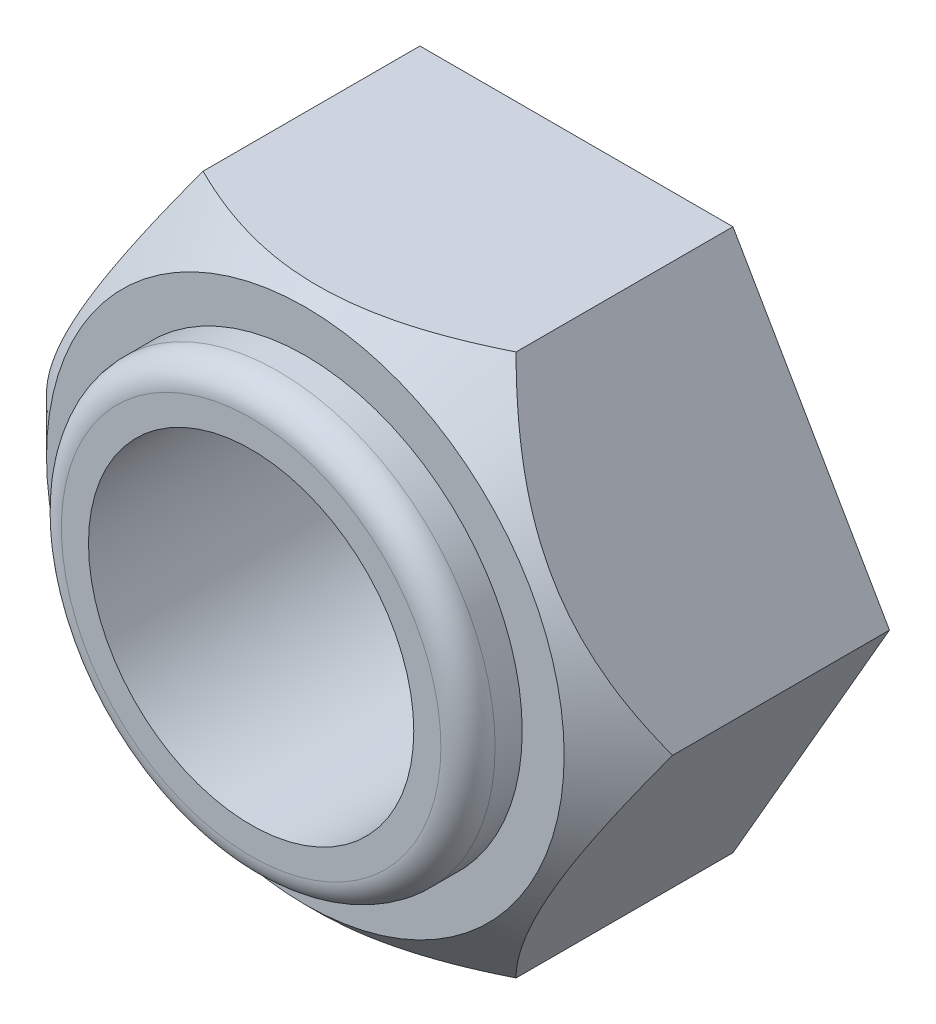
ISO-10303-21;
HEADER;
FILE_DESCRIPTION(('STEP AP214'),'2;1');
FILE_NAME('part.step','',(''),(''),'','','');
FILE_SCHEMA(('AUTOMOTIVE_DESIGN { 1 0 10303 214 1 1 1 1 }'));
ENDSEC;
DATA;
#1=APPLICATION_CONTEXT('core data for automotive mechanical design processes');
#2=APPLICATION_PROTOCOL_DEFINITION('international standard','automotive_design',2000,#1);
#3=PRODUCT_CONTEXT('',#1,'mechanical');
#4=PRODUCT('Part','Part','',(#3));
#5=PRODUCT_RELATED_PRODUCT_CATEGORY('part','',(#4));
#6=PRODUCT_DEFINITION_FORMATION('','',#4);
#7=PRODUCT_DEFINITION_CONTEXT('part definition',#1,'design');
#8=PRODUCT_DEFINITION('design','',#6,#7);
#9=PRODUCT_DEFINITION_SHAPE('','',#8);
#10=(LENGTH_UNIT() NAMED_UNIT(*) SI_UNIT(.MILLI.,.METRE.));
#11=(NAMED_UNIT(*) PLANE_ANGLE_UNIT() SI_UNIT($,.RADIAN.));
#12=(NAMED_UNIT(*) SI_UNIT($,.STERADIAN.) SOLID_ANGLE_UNIT());
#13=UNCERTAINTY_MEASURE_WITH_UNIT(LENGTH_MEASURE(1.E-05),#10,'distance_accuracy_value','');
#14=(GEOMETRIC_REPRESENTATION_CONTEXT(3) GLOBAL_UNCERTAINTY_ASSIGNED_CONTEXT((#13)) GLOBAL_UNIT_ASSIGNED_CONTEXT((#10,
#11,#12)) REPRESENTATION_CONTEXT('',''));
#15=CARTESIAN_POINT('',(0.,0.,0.));
#16=DIRECTION('',(0.,0.,1.));
#17=DIRECTION('',(1.,0.,0.));
#18=AXIS2_PLACEMENT_3D('',#15,#16,#17);
#19=CARTESIAN_POINT('',(2.88675134594812,-5.00000000000002,5.));
#20=DIRECTION('',(-0.866025403784439,0.5,0.));
#21=DIRECTION('',(-0.5,-0.866025403784439,0.));
#22=AXIS2_PLACEMENT_3D('',#19,#20,#21);
#23=PLANE('',#22);
#24=CARTESIAN_POINT('',(2.88663587589429,-5.00020000000002,3.99988452648214));
#25=CARTESIAN_POINT('',(2.93627227674212,-4.91422723182671,4.04951645439575));
#26=CARTESIAN_POINT('',(2.98629020977268,-4.82759363052821,4.09762527471311));
#27=CARTESIAN_POINT('',(3.08716399407134,-4.65287511097118,4.19033336867023));
#28=CARTESIAN_POINT('',(3.13802028490868,-4.56478943135641,4.23493072549852));
#29=CARTESIAN_POINT('',(3.29243146040538,-4.29734143013969,4.36314092787176));
#30=CARTESIAN_POINT('',(3.39729352840467,-4.11571500057819,4.44062493449849));
#31=CARTESIAN_POINT('',(3.60875628789732,-3.74945075722819,4.5733110555745));
#32=CARTESIAN_POINT('',(3.71530292847296,-3.56490656237541,4.62884745935418));
#33=CARTESIAN_POINT('',(3.87687459445692,-3.28505622782764,4.6930895059525));
#34=CARTESIAN_POINT('',(3.9309696979787,-3.19136076008722,4.71131783666138));
#35=CARTESIAN_POINT('',(4.03961794604879,-3.00317647427648,4.7410078128739));
#36=CARTESIAN_POINT('',(4.09417102090353,-2.90868777691896,4.75247046969493));
#37=CARTESIAN_POINT('',(4.22710825098566,-2.67843374019924,4.77168913825404));
#38=CARTESIAN_POINT('',(4.30563563855841,-2.54242031513758,4.77572171174031));
#39=CARTESIAN_POINT('',(4.46254889182113,-2.27063858810562,4.76895414589471));
#40=CARTESIAN_POINT('',(4.5409346982583,-2.13487038876419,4.75814880702902));
#41=CARTESIAN_POINT('',(4.69696731557988,-1.86461396792526,4.72234235010198));
#42=CARTESIAN_POINT('',(4.77461320108935,-1.73012734922417,4.69732535604176));
#43=CARTESIAN_POINT('',(4.92857043343805,-1.46346560060355,4.63445567501059));
#44=CARTESIAN_POINT('',(5.00488188213303,-1.33129029426464,4.59660397223246));
#45=CARTESIAN_POINT('',(5.14035048372463,-1.0966517934777,4.51873011323949));
#46=CARTESIAN_POINT('',(5.19980756415579,-0.993669109301218,4.480755749581));
#47=CARTESIAN_POINT('',(5.31765436322277,-0.789552465807839,4.39868737382608));
#48=CARTESIAN_POINT('',(5.37604404938545,-0.68841856273609,4.35459317589647));
#49=CARTESIAN_POINT('',(5.49157215635531,-0.488318011762032,4.26127361464766));
#50=CARTESIAN_POINT('',(5.54871386288991,-0.389345672812916,4.21206438729063));
#51=CARTESIAN_POINT('',(5.66193913120708,-0.193233755386961,4.10916087715701));
#52=CARTESIAN_POINT('',(5.71802331651611,-0.0960930969306211,4.055469345451));
#53=CARTESIAN_POINT('',(5.7736181619501,0.000199999999999348,3.99988452648215));
#54=B_SPLINE_CURVE_WITH_KNOTS('',3,(#24,#25,#26,#27,#28,#29,#30,#31,#32,#33,#34,#35,#36,#37,#38,
#39,#40,#41,#42,#43,#44,#45,#46,#47,#48,#49,#50,#51,#52,#53),.UNSPECIFIED.,.F.,.F.,(4,2,2,2,2,2,
2,2,2,2,2,2,2,2,4),(0.,0.33294561620957,0.666071736106994,1.33592065243335,1.99513262597482,
2.32409207808825,2.65300234563692,3.12358963991984,3.59434188052355,4.06562104077028,
4.53686407049612,4.91117956742318,5.28550643319672,5.65868635377117,6.03163889109475),.UNSPECIFIED.);
#55=CARTESIAN_POINT('',(2.88675134594814,-5.00000000000002,4.));
#56=VERTEX_POINT('',#55);
#57=CARTESIAN_POINT('',(5.77350269189628,0.,4.));
#58=VERTEX_POINT('',#57);
#59=EDGE_CURVE('E92',#56,#58,#54,.T.);
#60=ORIENTED_EDGE('',*,*,#59,.F.);
#61=DIRECTION('',(0.,0.,-1.));
#62=VECTOR('',#61,1.);
#63=CARTESIAN_POINT('',(2.88675134594812,-5.00000000000002,5.));
#64=LINE('',#63,#62);
#65=CARTESIAN_POINT('',(2.88675134594812,-5.00000000000002,0.));
#66=VERTEX_POINT('',#65);
#67=EDGE_CURVE('E63',#56,#66,#64,.T.);
#68=ORIENTED_EDGE('',*,*,#67,.T.);
#69=DIRECTION('',(0.5,0.866025403784439,0.));
#70=VECTOR('',#69,1.);
#71=CARTESIAN_POINT('',(2.88675134594812,-5.00000000000002,0.));
#72=LINE('',#71,#70);
#73=CARTESIAN_POINT('',(5.77350269189626,0.,0.));
#74=VERTEX_POINT('',#73);
#75=EDGE_CURVE('E111',#66,#74,#72,.T.);
#76=ORIENTED_EDGE('',*,*,#75,.T.);
#77=DIRECTION('',(0.,0.,-1.));
#78=VECTOR('',#77,1.);
#79=CARTESIAN_POINT('',(5.77350269189626,0.,5.));
#80=LINE('',#79,#78);
#81=EDGE_CURVE('E105',#58,#74,#80,.T.);
#82=ORIENTED_EDGE('',*,*,#81,.F.);
#83=EDGE_LOOP('',(#60,#68,#76,#82));
#84=FACE_BOUND('',#83,.T.);
#85=ADVANCED_FACE('F40',(#84),#23,.F.);
#86=CARTESIAN_POINT('',(5.77350269189626,0.,5.));
#87=DIRECTION('',(-0.866025403784439,-0.499999999999999,0.));
#88=DIRECTION('',(0.499999999999999,-0.866025403784439,0.));
#89=AXIS2_PLACEMENT_3D('',#86,#87,#88);
#90=PLANE('',#89);
#91=CARTESIAN_POINT('',(5.7736181619501,-0.000200000000000088,3.99988452648215));
#92=CARTESIAN_POINT('',(5.72398176110226,0.0857727681733068,4.04951645439576));
#93=CARTESIAN_POINT('',(5.67396382807171,0.172406369471808,4.09762527471312));
#94=CARTESIAN_POINT('',(5.57309004377304,0.347124889028838,4.19033336867024));
#95=CARTESIAN_POINT('',(5.52223375293571,0.435210568643608,4.23493072549853));
#96=CARTESIAN_POINT('',(5.36782257743901,0.702658569860328,4.36314092787176));
#97=CARTESIAN_POINT('',(5.26296050943972,0.884284999421826,4.4406249344985));
#98=CARTESIAN_POINT('',(5.05149774994707,1.25054924277182,4.5733110555745));
#99=CARTESIAN_POINT('',(4.94495110937143,1.4350934376246,4.62884745935418));
#100=CARTESIAN_POINT('',(4.78337944338747,1.71494377217237,4.6930895059525));
#101=CARTESIAN_POINT('',(4.72928433986569,1.80863923991279,4.71131783666138));
#102=CARTESIAN_POINT('',(4.62063609179561,1.99682352572353,4.7410078128739));
#103=CARTESIAN_POINT('',(4.56608301694087,2.09131222308105,4.75247046969493));
#104=CARTESIAN_POINT('',(4.43314578685874,2.32156625980077,4.77168913825404));
#105=CARTESIAN_POINT('',(4.35461839928599,2.45757968486242,4.77572171174031));
#106=CARTESIAN_POINT('',(4.19770514602326,2.72936141189439,4.76895414589471));
#107=CARTESIAN_POINT('',(4.1193193395861,2.86512961123581,4.75814880702902));
#108=CARTESIAN_POINT('',(3.96328672226452,3.13538603207475,4.72234235010198));
#109=CARTESIAN_POINT('',(3.88564083675504,3.26987265077583,4.69732535604176));
#110=CARTESIAN_POINT('',(3.73168360440635,3.53653439939645,4.63445567501059));
#111=CARTESIAN_POINT('',(3.65537215571136,3.66870970573536,4.59660397223246));
#112=CARTESIAN_POINT('',(3.51990355411977,3.90334820652231,4.51873011323948));
#113=CARTESIAN_POINT('',(3.4604464736886,4.00633089069879,4.480755749581));
#114=CARTESIAN_POINT('',(3.34259967462162,4.21044753419218,4.39868737382607));
#115=CARTESIAN_POINT('',(3.28420998845894,4.31158143726393,4.35459317589646));
#116=CARTESIAN_POINT('',(3.16868188148908,4.51168198823799,4.26127361464765));
#117=CARTESIAN_POINT('',(3.11154017495448,4.61065432718711,4.21206438729062));
#118=CARTESIAN_POINT('',(2.9983149066373,4.80676624461307,4.109160877157));
#119=CARTESIAN_POINT('',(2.94223072132828,4.90390690306941,4.05546934545098));
#120=CARTESIAN_POINT('',(2.88663587589428,5.00020000000004,3.99988452648213));
#121=B_SPLINE_CURVE_WITH_KNOTS('',3,(#91,#92,#93,#94,#95,#96,#97,#98,#99,#100,#101,#102,#103,
#104,#105,#106,#107,#108,#109,#110,#111,#112,#113,#114,#115,#116,#117,#118,#119,#120),
.UNSPECIFIED.,.F.,.F.,(4,2,2,2,2,2,2,2,2,2,2,2,2,2,4),(0.,0.332945616209567,0.666071736106988,
1.33592065243334,1.99513262597481,2.32409207808823,2.6530023456369,3.12358963991982,
3.59434188052352,4.06562104077025,4.53686407049609,4.91117956742317,5.28550643319671,
5.65868635377118,6.03163889109477),.UNSPECIFIED.);
#122=CARTESIAN_POINT('',(2.88675134594812,5.00000000000004,4.));
#123=VERTEX_POINT('',#122);
#124=EDGE_CURVE('E95',#58,#123,#121,.T.);
#125=ORIENTED_EDGE('',*,*,#124,.F.);
#126=ORIENTED_EDGE('',*,*,#81,.T.);
#127=DIRECTION('',(-0.5,0.866025403784439,0.));
#128=VECTOR('',#127,1.);
#129=CARTESIAN_POINT('',(5.77350269189626,0.,0.));
#130=LINE('',#129,#128);
#131=CARTESIAN_POINT('',(2.88675134594812,5.00000000000004,0.));
#132=VERTEX_POINT('',#131);
#133=EDGE_CURVE('E226',#74,#132,#130,.T.);
#134=ORIENTED_EDGE('',*,*,#133,.T.);
#135=DIRECTION('',(0.,0.,-1.));
#136=VECTOR('',#135,1.);
#137=CARTESIAN_POINT('',(2.88675134594812,5.00000000000004,5.));
#138=LINE('',#137,#136);
#139=EDGE_CURVE('E107',#123,#132,#138,.T.);
#140=ORIENTED_EDGE('',*,*,#139,.F.);
#141=EDGE_LOOP('',(#125,#126,#134,#140));
#142=FACE_BOUND('',#141,.T.);
#143=ADVANCED_FACE('F103',(#142),#90,.F.);
#144=CARTESIAN_POINT('',(2.88675134594812,5.00000000000004,5.));
#145=DIRECTION('',(0.,-1.,0.));
#146=DIRECTION('',(0.,0.,-1.));
#147=AXIS2_PLACEMENT_3D('',#144,#145,#146);
#148=PLANE('',#147);
#149=CARTESIAN_POINT('',(8.74641662303042,5.00000000000004,-0.301208407863517));
#150=CARTESIAN_POINT('',(8.61716722747171,5.00000000000004,-0.18900265269321));
#151=CARTESIAN_POINT('',(8.48761777621508,5.00000000000004,-0.0771427928280981));
#152=CARTESIAN_POINT('',(8.2278388656877,5.00000000000004,0.145788626938396));
#153=CARTESIAN_POINT('',(8.09760939532865,5.00000000000004,0.256860173915549));
#154=CARTESIAN_POINT('',(7.70566734866914,5.00000000000004,0.588843823896048));
#155=CARTESIAN_POINT('',(7.44281985997346,5.00000000000004,0.808421562615799));
#156=CARTESIAN_POINT('',(6.90728256215138,5.00000000000004,1.24785978995438));
#157=CARTESIAN_POINT('',(6.63450482165784,5.00000000000004,1.46761333529599));
#158=CARTESIAN_POINT('',(6.08382967998017,5.00000000000004,1.90051592874339));
#159=CARTESIAN_POINT('',(5.80593357662144,5.00000000000004,2.11366661530352));
#160=CARTESIAN_POINT('',(5.3837875337603,5.00000000000004,2.42664582311014));
#161=CARTESIAN_POINT('',(5.24208933175032,5.00000000000004,2.52991640153745));
#162=CARTESIAN_POINT('',(4.95671624927879,5.00000000000004,2.73368479134246));
#163=CARTESIAN_POINT('',(4.81304144911576,5.00000000000004,2.83418271486262));
#164=CARTESIAN_POINT('',(4.52327399537159,5.00000000000004,3.0319313954413));
#165=CARTESIAN_POINT('',(4.37717923691742,5.00000000000004,3.12917907677106));
#166=CARTESIAN_POINT('',(4.08235982087792,5.00000000000004,3.31958974364349));
#167=CARTESIAN_POINT('',(3.93363539364331,5.00000000000004,3.41275308449836));
#168=CARTESIAN_POINT('',(3.63427030631385,5.00000000000004,3.59339124751976));
#169=CARTESIAN_POINT('',(3.48365224734243,5.00000000000004,3.68090335176445));
#170=CARTESIAN_POINT('',(3.17899028727333,5.00000000000004,3.84982950091495));
#171=CARTESIAN_POINT('',(3.0249459760889,5.00000000000004,3.93124281070914));
#172=CARTESIAN_POINT('',(2.71327651039529,5.00000000000004,4.08635680952457));
#173=CARTESIAN_POINT('',(2.55565698972107,5.00000000000004,4.16006872891488));
#174=CARTESIAN_POINT('',(2.23636855072569,5.00000000000004,4.29804542214498));
#175=CARTESIAN_POINT('',(2.0747012300384,5.00000000000004,4.36231385654506));
#176=CARTESIAN_POINT('',(1.74341514966673,5.00000000000004,4.48058010821295));
#177=CARTESIAN_POINT('',(1.57369908899827,5.00000000000004,4.5343091939955));
#178=CARTESIAN_POINT('',(1.2302480983104,5.00000000000004,4.6270272265735));
#179=CARTESIAN_POINT('',(1.05651381384523,5.00000000000004,4.66601852387466));
#180=CARTESIAN_POINT('',(0.707111716198501,5.00000000000004,4.72665904639808));
#181=CARTESIAN_POINT('',(0.531462959940002,5.00000000000004,4.748415898073));
#182=CARTESIAN_POINT('',(0.178842057305452,5.00000000000004,4.77339456437262));
#183=CARTESIAN_POINT('',(0.00187005969024226,5.00000000000004,4.77661843204289));
#184=CARTESIAN_POINT('',(-0.351677312644637,5.00000000000004,4.76427057204263));
#185=CARTESIAN_POINT('',(-0.52825164496912,5.00000000000004,4.74866965464559));
#186=CARTESIAN_POINT('',(-0.878922878802927,5.00000000000004,4.69981404905934));
#187=CARTESIAN_POINT('',(-1.05301927886704,5.00000000000004,4.6665558383859));
#188=CARTESIAN_POINT('',(-1.39870451047173,5.00000000000004,4.58428775797559));
#189=CARTESIAN_POINT('',(-1.57026635442501,5.00000000000004,4.53516648098519));
#190=CARTESIAN_POINT('',(-1.90902834046002,5.00000000000004,4.42385082373352));
#191=CARTESIAN_POINT('',(-2.07622841650059,5.00000000000004,4.36165624565947));
#192=CARTESIAN_POINT('',(-2.44237261212091,5.00000000000004,4.21189684661848));
#193=CARTESIAN_POINT('',(-2.64025507818798,5.00000000000004,4.12175861027969));
#194=CARTESIAN_POINT('',(-3.03013540194511,5.00000000000004,3.92945066467156));
#195=CARTESIAN_POINT('',(-3.2221297939639,5.00000000000004,3.82727403472283));
#196=CARTESIAN_POINT('',(-3.6013148895169,5.00000000000004,3.61355948176254));
#197=CARTESIAN_POINT('',(-3.78849486749633,5.00000000000004,3.50200268378292));
#198=CARTESIAN_POINT('',(-4.15840113964409,5.00000000000004,3.27186071614721));
#199=CARTESIAN_POINT('',(-4.34112830476983,5.00000000000004,3.15327693677571));
#200=CARTESIAN_POINT('',(-4.70385374189554,5.00000000000004,2.9099715592438));
#201=CARTESIAN_POINT('',(-4.88383213902449,5.00000000000004,2.78522047097765));
#202=CARTESIAN_POINT('',(-5.24067161838543,5.00000000000004,2.5313395110119));
#203=CARTESIAN_POINT('',(-5.41753258816007,5.00000000000004,2.40220948183671));
#204=CARTESIAN_POINT('',(-5.76843263526257,5.00000000000004,2.14060255735723));
#205=CARTESIAN_POINT('',(-5.9424747714486,5.00000000000004,2.00812975366595));
#206=CARTESIAN_POINT('',(-6.28836717451632,5.00000000000004,1.74034738516016));
#207=CARTESIAN_POINT('',(-6.46021736942777,5.00000000000004,1.60503772758402));
#208=CARTESIAN_POINT('',(-6.81175541238483,5.00000000000004,1.32434967443559));
#209=CARTESIAN_POINT('',(-6.99133474536094,5.00000000000004,1.17883558211282));
#210=CARTESIAN_POINT('',(-7.3487414292176,5.00000000000004,0.885670418220361));
#211=CARTESIAN_POINT('',(-7.52656875943074,5.00000000000004,0.738019321492221));
#212=CARTESIAN_POINT('',(-7.87878816127483,5.00000000000004,0.442575931013861));
#213=CARTESIAN_POINT('',(-8.05319650955843,5.00000000000004,0.294803014002272));
#214=CARTESIAN_POINT('',(-8.40071799614819,5.00000000000004,-0.00218161213356676));
#215=CARTESIAN_POINT('',(-8.57383141139473,5.00000000000004,-0.151392997033742));
#216=CARTESIAN_POINT('',(-8.74641662303044,5.00000000000004,-0.301208407863527));
#217=B_SPLINE_CURVE_WITH_KNOTS('',3,(#149,#150,#151,#152,#153,#154,#155,#156,#157,#158,#159,
#160,#161,#162,#163,#164,#165,#166,#167,#168,#169,#170,#171,#172,#173,#174,#175,#176,#177,#178,
#179,#180,#181,#182,#183,#184,#185,#186,#187,#188,#189,#190,#191,#192,#193,#194,#195,#196,#197,
#198,#199,#200,#201,#202,#203,#204,#205,#206,#207,#208,#209,#210,#211,#212,#213,#214,#215,#216),
.UNSPECIFIED.,.F.,.F.,(4,2,2,2,2,2,2,2,2,2,2,2,2,2,2,2,2,2,2,2,2,2,2,2,2,2,2,2,2,2,2,2,2,4),(0.,
0.513476804360356,1.02696200771218,2.05440464274526,3.10519307167231,4.15571863124172,
4.68170485901195,5.20766978152948,5.73411909352894,6.26052251646932,6.78299524430335,
7.30553084683201,7.82729351501778,8.34885339673755,8.88235034246742,9.41576216570619,
9.94581605965252,10.4758112341946,11.0066292768164,11.537553253067,12.0722901283652,
12.6070350953767,13.2588184936859,13.9109784370994,14.5644836027156,15.2178599015941,
15.8747380640421,16.5316398742656,17.1877732869577,17.8439281879696,18.5373113067269,
19.2307025951712,19.9164752192631,20.6020967282287),.UNSPECIFIED.);
#218=CARTESIAN_POINT('',(-2.88675134594814,5.00000000000002,4.));
#219=VERTEX_POINT('',#218);
#220=EDGE_CURVE('E108',#123,#219,#217,.T.);
#221=ORIENTED_EDGE('',*,*,#220,.F.);
#222=ORIENTED_EDGE('',*,*,#139,.T.);
#223=DIRECTION('',(-1.,0.,0.));
#224=VECTOR('',#223,1.);
#225=CARTESIAN_POINT('',(2.88675134594812,5.00000000000004,0.));
#226=LINE('',#225,#224);
#227=CARTESIAN_POINT('',(-2.88675134594813,5.00000000000004,0.));
#228=VERTEX_POINT('',#227);
#229=EDGE_CURVE('E228',#132,#228,#226,.T.);
#230=ORIENTED_EDGE('',*,*,#229,.T.);
#231=DIRECTION('',(0.,0.,-1.));
#232=VECTOR('',#231,1.);
#233=CARTESIAN_POINT('',(-2.88675134594813,5.00000000000004,5.));
#234=LINE('',#233,#232);
#235=EDGE_CURVE('E116',#219,#228,#234,.T.);
#236=ORIENTED_EDGE('',*,*,#235,.F.);
#237=EDGE_LOOP('',(#221,#222,#230,#236));
#238=FACE_BOUND('',#237,.T.);
#239=ADVANCED_FACE('F143',(#238),#148,.F.);
#240=CARTESIAN_POINT('',(-2.88675134594813,5.00000000000004,5.));
#241=DIRECTION('',(0.866025403784438,-0.5,0.));
#242=DIRECTION('',(0.5,0.866025403784438,0.));
#243=AXIS2_PLACEMENT_3D('',#240,#241,#242);
#244=PLANE('',#243);
#245=CARTESIAN_POINT('',(-2.88663587589429,5.00020000000004,3.99988452648212));
#246=CARTESIAN_POINT('',(-2.93627227674213,4.91422723182673,4.04951645439573));
#247=CARTESIAN_POINT('',(-2.98629020977269,4.82759363052823,4.09762527471309));
#248=CARTESIAN_POINT('',(-3.08716399407135,4.65287511097119,4.19033336867022));
#249=CARTESIAN_POINT('',(-3.13802028490869,4.56478943135642,4.23493072549851));
#250=CARTESIAN_POINT('',(-3.29243146040539,4.2973414301397,4.36314092787174));
#251=CARTESIAN_POINT('',(-3.39729352840468,4.1157150005782,4.44062493449848));
#252=CARTESIAN_POINT('',(-3.60875628789733,3.74945075722821,4.57331105557448));
#253=CARTESIAN_POINT('',(-3.71530292847297,3.56490656237542,4.62884745935416));
#254=CARTESIAN_POINT('',(-3.87687459445693,3.28505622782765,4.69308950595248));
#255=CARTESIAN_POINT('',(-3.93096969797871,3.19136076008723,4.71131783666136));
#256=CARTESIAN_POINT('',(-4.0396179460488,3.00317647427649,4.74100781287388));
#257=CARTESIAN_POINT('',(-4.09417102090354,2.90868777691897,4.75247046969492));
#258=CARTESIAN_POINT('',(-4.22710825098567,2.67843374019925,4.77168913825402));
#259=CARTESIAN_POINT('',(-4.30563563855842,2.54242031513759,4.77572171174029));
#260=CARTESIAN_POINT('',(-4.46254889182115,2.27063858810563,4.76895414589469));
#261=CARTESIAN_POINT('',(-4.54093469825831,2.1348703887642,4.75814880702901));
#262=CARTESIAN_POINT('',(-4.69696731557989,1.86461396792527,4.72234235010197));
#263=CARTESIAN_POINT('',(-4.77461320108937,1.73012734922418,4.69732535604174));
#264=CARTESIAN_POINT('',(-4.92857043343806,1.46346560060356,4.63445567501057));
#265=CARTESIAN_POINT('',(-5.00488188213305,1.33129029426465,4.59660397223244));
#266=CARTESIAN_POINT('',(-5.14035048372464,1.09665179347771,4.51873011323947));
#267=CARTESIAN_POINT('',(-5.19980756415581,0.993669109301225,4.48075574958099));
#268=CARTESIAN_POINT('',(-5.31765436322279,0.789552465807845,4.39868737382606));
#269=CARTESIAN_POINT('',(-5.37604404938546,0.688418562736095,4.35459317589645));
#270=CARTESIAN_POINT('',(-5.49157215635533,0.488318011762036,4.26127361464764));
#271=CARTESIAN_POINT('',(-5.54871386288993,0.389345672812919,4.21206438729061));
#272=CARTESIAN_POINT('',(-5.6619391312071,0.193233755386962,4.10916087715699));
#273=CARTESIAN_POINT('',(-5.71802331651612,0.0960930969306211,4.05546934545098));
#274=CARTESIAN_POINT('',(-5.77361816195012,-0.000199999999999433,3.99988452648213));
#275=B_SPLINE_CURVE_WITH_KNOTS('',3,(#245,#246,#247,#248,#249,#250,#251,#252,#253,#254,#255,
#256,#257,#258,#259,#260,#261,#262,#263,#264,#265,#266,#267,#268,#269,#270,#271,#272,#273,#274),
.UNSPECIFIED.,.F.,.F.,(4,2,2,2,2,2,2,2,2,2,2,2,2,2,4),(0.,0.33294561620957,0.666071736106994,
1.33592065243335,1.99513262597483,2.32409207808826,2.65300234563692,3.12358963991985,
3.59434188052355,4.06562104077028,4.53686407049612,4.91117956742319,5.28550643319673,
5.65868635377119,6.03163889109477),.UNSPECIFIED.);
#276=CARTESIAN_POINT('',(-5.77350269189628,0.,4.));
#277=VERTEX_POINT('',#276);
#278=EDGE_CURVE('E180',#219,#277,#275,.T.);
#279=ORIENTED_EDGE('',*,*,#278,.F.);
#280=ORIENTED_EDGE('',*,*,#235,.T.);
#281=DIRECTION('',(-0.5,-0.866025403784439,0.));
#282=VECTOR('',#281,1.);
#283=CARTESIAN_POINT('',(-2.88675134594813,5.00000000000004,0.));
#284=LINE('',#283,#282);
#285=CARTESIAN_POINT('',(-5.77350269189628,0.,0.));
#286=VERTEX_POINT('',#285);
#287=EDGE_CURVE('E233',#228,#286,#284,.T.);
#288=ORIENTED_EDGE('',*,*,#287,.T.);
#289=DIRECTION('',(0.,0.,-1.));
#290=VECTOR('',#289,1.);
#291=CARTESIAN_POINT('',(-5.77350269189628,0.,5.));
#292=LINE('',#291,#290);
#293=EDGE_CURVE('E244',#277,#286,#292,.T.);
#294=ORIENTED_EDGE('',*,*,#293,.F.);
#295=EDGE_LOOP('',(#279,#280,#288,#294));
#296=FACE_BOUND('',#295,.T.);
#297=ADVANCED_FACE('F192',(#296),#244,.F.);
#298=CARTESIAN_POINT('',(-5.77350269189628,0.,5.));
#299=DIRECTION('',(0.866025403784438,0.5,0.));
#300=DIRECTION('',(-0.5,0.866025403784439,0.));
#301=AXIS2_PLACEMENT_3D('',#298,#299,#300);
#302=PLANE('',#301);
#303=CARTESIAN_POINT('',(-5.77361816195012,0.000200000000000088,3.99988452648213));
#304=CARTESIAN_POINT('',(-5.72398176110228,-0.0857727681733072,4.04951645439574));
#305=CARTESIAN_POINT('',(-5.67396382807173,-0.172406369471809,4.09762527471309));
#306=CARTESIAN_POINT('',(-5.57309004377306,-0.34712488902884,4.19033336867022));
#307=CARTESIAN_POINT('',(-5.52223375293572,-0.435210568643611,4.23493072549851));
#308=CARTESIAN_POINT('',(-5.36782257743902,-0.702658569860332,4.36314092787175));
#309=CARTESIAN_POINT('',(-5.26296050943974,-0.884284999421832,4.44062493449848));
#310=CARTESIAN_POINT('',(-5.05149774994709,-1.25054924277183,4.57331105557449));
#311=CARTESIAN_POINT('',(-4.94495110937145,-1.43509343762461,4.62884745935416));
#312=CARTESIAN_POINT('',(-4.78337944338749,-1.71494377217238,4.69308950595248));
#313=CARTESIAN_POINT('',(-4.72928433986571,-1.8086392399128,4.71131783666137));
#314=CARTESIAN_POINT('',(-4.62063609179562,-1.99682352572354,4.74100781287388));
#315=CARTESIAN_POINT('',(-4.56608301694088,-2.09131222308106,4.75247046969492));
#316=CARTESIAN_POINT('',(-4.43314578685875,-2.32156625980078,4.77168913825402));
#317=CARTESIAN_POINT('',(-4.354618399286,-2.45757968486244,4.77572171174029));
#318=CARTESIAN_POINT('',(-4.19770514602327,-2.7293614118944,4.76895414589469));
#319=CARTESIAN_POINT('',(-4.11931933958611,-2.86512961123583,4.75814880702901));
#320=CARTESIAN_POINT('',(-3.96328672226453,-3.13538603207476,4.72234235010197));
#321=CARTESIAN_POINT('',(-3.88564083675505,-3.26987265077585,4.69732535604174));
#322=CARTESIAN_POINT('',(-3.73168360440636,-3.53653439939647,4.63445567501057));
#323=CARTESIAN_POINT('',(-3.65537215571137,-3.66870970573538,4.59660397223244));
#324=CARTESIAN_POINT('',(-3.51990355411978,-3.90334820652232,4.51873011323946));
#325=CARTESIAN_POINT('',(-3.46044647368861,-4.0063308906988,4.48075574958099));
#326=CARTESIAN_POINT('',(-3.34259967462163,-4.21044753419218,4.39868737382606));
#327=CARTESIAN_POINT('',(-3.28420998845896,-4.31158143726393,4.35459317589645));
#328=CARTESIAN_POINT('',(-3.16868188148909,-4.51168198823799,4.26127361464764));
#329=CARTESIAN_POINT('',(-3.11154017495449,-4.61065432718711,4.21206438729061));
#330=CARTESIAN_POINT('',(-2.99831490663732,-4.80676624461307,4.10916087715699));
#331=CARTESIAN_POINT('',(-2.9422307213283,-4.90390690306941,4.05546934545098));
#332=CARTESIAN_POINT('',(-2.8866358758943,-5.00020000000003,3.99988452648213));
#333=B_SPLINE_CURVE_WITH_KNOTS('',3,(#303,#304,#305,#306,#307,#308,#309,#310,#311,#312,#313,
#314,#315,#316,#317,#318,#319,#320,#321,#322,#323,#324,#325,#326,#327,#328,#329,#330,#331,#332),
.UNSPECIFIED.,.F.,.F.,(4,2,2,2,2,2,2,2,2,2,2,2,2,2,4),(0.,0.332945616209569,0.666071736106993,
1.33592065243335,1.99513262597482,2.32409207808825,2.65300234563692,3.12358963991984,
3.59434188052354,4.06562104077028,4.53686407049612,4.91117956742318,5.28550643319672,
5.65868635377118,6.03163889109476),.UNSPECIFIED.);
#334=CARTESIAN_POINT('',(-2.88675134594814,-5.00000000000002,4.));
#335=VERTEX_POINT('',#334);
#336=EDGE_CURVE('E55',#277,#335,#333,.T.);
#337=ORIENTED_EDGE('',*,*,#336,.F.);
#338=ORIENTED_EDGE('',*,*,#293,.T.);
#339=DIRECTION('',(0.5,-0.866025403784439,0.));
#340=VECTOR('',#339,1.);
#341=CARTESIAN_POINT('',(-5.77350269189628,0.,0.));
#342=LINE('',#341,#340);
#343=CARTESIAN_POINT('',(-2.88675134594814,-5.00000000000002,0.));
#344=VERTEX_POINT('',#343);
#345=EDGE_CURVE('E236',#286,#344,#342,.T.);
#346=ORIENTED_EDGE('',*,*,#345,.T.);
#347=DIRECTION('',(0.,0.,-1.));
#348=VECTOR('',#347,1.);
#349=CARTESIAN_POINT('',(-2.88675134594814,-5.00000000000002,5.));
#350=LINE('',#349,#348);
#351=EDGE_CURVE('E242',#335,#344,#350,.T.);
#352=ORIENTED_EDGE('',*,*,#351,.F.);
#353=EDGE_LOOP('',(#337,#338,#346,#352));
#354=FACE_BOUND('',#353,.T.);
#355=ADVANCED_FACE('F196',(#354),#302,.F.);
#356=CARTESIAN_POINT('',(-2.88675134594814,-5.00000000000002,5.));
#357=DIRECTION('',(0.,1.,0.));
#358=DIRECTION('',(-1.,0.,0.));
#359=AXIS2_PLACEMENT_3D('',#356,#357,#358);
#360=PLANE('',#359);
#361=CARTESIAN_POINT('',(-8.74641662303046,-5.00000000000003,-0.301208407863542));
#362=CARTESIAN_POINT('',(-8.61716722747174,-5.00000000000003,-0.189002652693235));
#363=CARTESIAN_POINT('',(-8.48761777621512,-5.00000000000003,-0.0771427928281225));
#364=CARTESIAN_POINT('',(-8.22783886568774,-5.00000000000003,0.145788626938372));
#365=CARTESIAN_POINT('',(-8.09760939532868,-5.00000000000003,0.256860173915524));
#366=CARTESIAN_POINT('',(-7.70566734866918,-5.00000000000003,0.588843823896024));
#367=CARTESIAN_POINT('',(-7.44281985997349,-5.00000000000003,0.808421562615777));
#368=CARTESIAN_POINT('',(-6.90728256215141,-5.00000000000003,1.24785978995436));
#369=CARTESIAN_POINT('',(-6.63450482165787,-5.00000000000003,1.46761333529597));
#370=CARTESIAN_POINT('',(-6.0838296799802,-5.00000000000003,1.90051592874337));
#371=CARTESIAN_POINT('',(-5.80593357662146,-5.00000000000003,2.1136666153035));
#372=CARTESIAN_POINT('',(-5.38378753376033,-5.00000000000003,2.42664582311013));
#373=CARTESIAN_POINT('',(-5.24208933175034,-5.00000000000003,2.52991640153744));
#374=CARTESIAN_POINT('',(-4.95671624927881,-5.00000000000003,2.73368479134245));
#375=CARTESIAN_POINT('',(-4.81304144911579,-5.00000000000003,2.83418271486261));
#376=CARTESIAN_POINT('',(-4.52327399537161,-5.00000000000003,3.03193139544129));
#377=CARTESIAN_POINT('',(-4.37717923691744,-5.00000000000003,3.12917907677105));
#378=CARTESIAN_POINT('',(-4.08235982087794,-5.00000000000003,3.31958974364349));
#379=CARTESIAN_POINT('',(-3.93363539364333,-5.00000000000003,3.41275308449835));
#380=CARTESIAN_POINT('',(-3.63427030631387,-5.00000000000003,3.59339124751975));
#381=CARTESIAN_POINT('',(-3.48365224734245,-5.00000000000002,3.68090335176445));
#382=CARTESIAN_POINT('',(-3.17899028727335,-5.00000000000002,3.84982950091495));
#383=CARTESIAN_POINT('',(-3.02494597608892,-5.00000000000002,3.93124281070914));
#384=CARTESIAN_POINT('',(-2.71327651039531,-5.00000000000002,4.08635680952457));
#385=CARTESIAN_POINT('',(-2.55565698972109,-5.00000000000002,4.16006872891488));
#386=CARTESIAN_POINT('',(-2.23636855072571,-5.00000000000002,4.29804542214498));
#387=CARTESIAN_POINT('',(-2.07470123003842,-5.00000000000002,4.36231385654506));
#388=CARTESIAN_POINT('',(-1.74341514966675,-5.00000000000002,4.48058010821295));
#389=CARTESIAN_POINT('',(-1.57369908899829,-5.00000000000002,4.5343091939955));
#390=CARTESIAN_POINT('',(-1.23024809831042,-5.00000000000002,4.62702722657351));
#391=CARTESIAN_POINT('',(-1.05651381384525,-5.00000000000002,4.66601852387467));
#392=CARTESIAN_POINT('',(-0.707111716198518,-5.00000000000002,4.72665904639809));
#393=CARTESIAN_POINT('',(-0.53146295994002,-5.00000000000002,4.74841589807301));
#394=CARTESIAN_POINT('',(-0.178842057305468,-5.00000000000002,4.77339456437263));
#395=CARTESIAN_POINT('',(-0.00187005969025795,-5.00000000000002,4.7766184320429));
#396=CARTESIAN_POINT('',(0.351677312644623,-5.00000000000002,4.76427057204264));
#397=CARTESIAN_POINT('',(0.528251644969106,-5.00000000000002,4.7486696546456));
#398=CARTESIAN_POINT('',(0.878922878802915,-5.00000000000002,4.69981404905935));
#399=CARTESIAN_POINT('',(1.05301927886703,-5.00000000000002,4.66655583838591));
#400=CARTESIAN_POINT('',(1.39870451047172,-5.00000000000002,4.5842877579756));
#401=CARTESIAN_POINT('',(1.570266354425,-5.00000000000002,4.5351664809852));
#402=CARTESIAN_POINT('',(1.90902834046001,-5.00000000000002,4.42385082373354));
#403=CARTESIAN_POINT('',(2.07622841650058,-5.00000000000002,4.36165624565948));
#404=CARTESIAN_POINT('',(2.4423726121209,-5.00000000000002,4.2118968466185));
#405=CARTESIAN_POINT('',(2.64025507818797,-5.00000000000002,4.12175861027971));
#406=CARTESIAN_POINT('',(3.0301354019451,-5.00000000000002,3.92945066467158));
#407=CARTESIAN_POINT('',(3.22212979396389,-5.00000000000002,3.82727403472285));
#408=CARTESIAN_POINT('',(3.60131488951688,-5.00000000000002,3.61355948176256));
#409=CARTESIAN_POINT('',(3.78849486749631,-5.00000000000002,3.50200268378294));
#410=CARTESIAN_POINT('',(4.15840113964408,-5.00000000000002,3.27186071614723));
#411=CARTESIAN_POINT('',(4.34112830476981,-5.00000000000002,3.15327693677573));
#412=CARTESIAN_POINT('',(4.70385374189552,-5.00000000000002,2.90997155924383));
#413=CARTESIAN_POINT('',(4.88383213902447,-5.00000000000002,2.78522047097768));
#414=CARTESIAN_POINT('',(5.24067161838541,-5.00000000000002,2.53133951101193));
#415=CARTESIAN_POINT('',(5.41753258816004,-5.00000000000002,2.40220948183674));
#416=CARTESIAN_POINT('',(5.76843263526254,-5.00000000000002,2.14060255735726));
#417=CARTESIAN_POINT('',(5.94247477144858,-5.00000000000002,2.00812975366599));
#418=CARTESIAN_POINT('',(6.28836717451629,-5.00000000000002,1.74034738516019));
#419=CARTESIAN_POINT('',(6.46021736942774,-5.00000000000002,1.60503772758405));
#420=CARTESIAN_POINT('',(6.81175541238481,-5.00000000000002,1.32434967443563));
#421=CARTESIAN_POINT('',(6.99133474536092,-5.00000000000002,1.17883558211285));
#422=CARTESIAN_POINT('',(7.34874142921758,-5.00000000000002,0.885670418220386));
#423=CARTESIAN_POINT('',(7.52656875943073,-5.00000000000002,0.738019321492243));
#424=CARTESIAN_POINT('',(7.87878816127482,-5.00000000000002,0.442575931013878));
#425=CARTESIAN_POINT('',(8.05319650955842,-5.00000000000002,0.294803014002285));
#426=CARTESIAN_POINT('',(8.40071799614819,-5.00000000000002,-0.00218161213355863));
#427=CARTESIAN_POINT('',(8.57383141139473,-5.00000000000002,-0.151392997033736));
#428=CARTESIAN_POINT('',(8.74641662303044,-5.00000000000002,-0.301208407863524));
#429=B_SPLINE_CURVE_WITH_KNOTS('',3,(#361,#362,#363,#364,#365,#366,#367,#368,#369,#370,#371,
#372,#373,#374,#375,#376,#377,#378,#379,#380,#381,#382,#383,#384,#385,#386,#387,#388,#389,#390,
#391,#392,#393,#394,#395,#396,#397,#398,#399,#400,#401,#402,#403,#404,#405,#406,#407,#408,#409,
#410,#411,#412,#413,#414,#415,#416,#417,#418,#419,#420,#421,#422,#423,#424,#425,#426,#427,#428),
.UNSPECIFIED.,.F.,.F.,(4,2,2,2,2,2,2,2,2,2,2,2,2,2,2,2,2,2,2,2,2,2,2,2,2,2,2,2,2,2,2,2,2,4),(0.,
0.513476804360357,1.02696200771218,2.05440464274526,3.10519307167232,4.15571863124174,
4.68170485901197,5.2076697815295,5.73411909352896,6.26052251646934,6.78299524430337,
7.30553084683203,7.82729351501781,8.34885339673758,8.88235034246745,9.41576216570623,
9.94581605965255,10.4758112341947,11.0066292768165,11.537553253067,12.0722901283653,
12.6070350953768,13.2588184936859,13.9109784370994,14.5644836027156,15.2178599015941,
15.8747380640421,16.5316398742656,17.1877732869577,17.8439281879696,18.5373113067269,
19.2307025951712,19.9164752192631,20.6020967282288),.UNSPECIFIED.);
#430=EDGE_CURVE('E97',#335,#56,#429,.T.);
#431=ORIENTED_EDGE('',*,*,#430,.F.);
#432=ORIENTED_EDGE('',*,*,#351,.T.);
#433=DIRECTION('',(1.,0.,0.));
#434=VECTOR('',#433,1.);
#435=CARTESIAN_POINT('',(-2.88675134594814,-5.00000000000002,0.));
#436=LINE('',#435,#434);
#437=EDGE_CURVE('E239',#344,#66,#436,.T.);
#438=ORIENTED_EDGE('',*,*,#437,.T.);
#439=ORIENTED_EDGE('',*,*,#67,.F.);
#440=EDGE_LOOP('',(#431,#432,#438,#439));
#441=FACE_BOUND('',#440,.T.);
#442=ADVANCED_FACE('F200',(#441),#360,.F.);
#443=CARTESIAN_POINT('',(0.,0.,5.));
#444=DIRECTION('',(0.,0.,1.));
#445=DIRECTION('',(1.,0.,0.));
#446=AXIS2_PLACEMENT_3D('',#443,#444,#445);
#447=PLANE('',#446);
#448=CARTESIAN_POINT('',(0.,0.,5.));
#449=DIRECTION('',(0.,0.,1.));
#450=DIRECTION('',(1.,0.,0.));
#451=AXIS2_PLACEMENT_3D('',#448,#449,#450);
#452=CIRCLE('',#451,4.);
#453=CARTESIAN_POINT('',(4.,0.,5.));
#454=VERTEX_POINT('',#453);
#455=EDGE_CURVE('E112',#454,#454,#452,.T.);
#456=ORIENTED_EDGE('',*,*,#455,.F.);
#457=EDGE_LOOP('',(#456));
#458=FACE_BOUND('',#457,.T.);
#459=CARTESIAN_POINT('',(0.,0.,5.));
#460=DIRECTION('',(0.,0.,1.));
#461=DIRECTION('',(1.,0.,0.));
#462=AXIS2_PLACEMENT_3D('',#459,#460,#461);
#463=CIRCLE('',#462,4.77350269189628);
#464=CARTESIAN_POINT('',(4.77350269189628,0.,5.));
#465=VERTEX_POINT('',#464);
#466=EDGE_CURVE('E254',#465,#465,#463,.T.);
#467=ORIENTED_EDGE('',*,*,#466,.T.);
#468=EDGE_LOOP('',(#467));
#469=FACE_BOUND('',#468,.T.);
#470=ADVANCED_FACE('F205',(#458,#469),#447,.T.);
#471=CARTESIAN_POINT('',(0.,0.,0.));
#472=DIRECTION('',(0.,0.,1.));
#473=DIRECTION('',(1.,0.,0.));
#474=AXIS2_PLACEMENT_3D('',#471,#472,#473);
#475=PLANE('',#474);
#476=CARTESIAN_POINT('',(0.,0.,0.));
#477=DIRECTION('',(0.,0.,1.));
#478=DIRECTION('',(1.,0.,0.));
#479=AXIS2_PLACEMENT_3D('',#476,#477,#478);
#480=CIRCLE('',#479,3.);
#481=CARTESIAN_POINT('',(3.,0.,0.));
#482=VERTEX_POINT('',#481);
#483=EDGE_CURVE('E121',#482,#482,#480,.T.);
#484=ORIENTED_EDGE('',*,*,#483,.T.);
#485=EDGE_LOOP('',(#484));
#486=FACE_BOUND('',#485,.T.);
#487=ORIENTED_EDGE('',*,*,#75,.F.);
#488=ORIENTED_EDGE('',*,*,#437,.F.);
#489=ORIENTED_EDGE('',*,*,#345,.F.);
#490=ORIENTED_EDGE('',*,*,#287,.F.);
#491=ORIENTED_EDGE('',*,*,#229,.F.);
#492=ORIENTED_EDGE('',*,*,#133,.F.);
#493=EDGE_LOOP('',(#487,#488,#489,#490,#491,#492));
#494=FACE_BOUND('',#493,.T.);
#495=ADVANCED_FACE('F207',(#486,#494),#475,.F.);
#496=CARTESIAN_POINT('',(0.,0.,6.));
#497=DIRECTION('',(0.,0.,-1.));
#498=DIRECTION('',(-1.,0.,0.));
#499=AXIS2_PLACEMENT_3D('',#496,#497,#498);
#500=CYLINDRICAL_SURFACE('',#499,4.);
#501=CARTESIAN_POINT('',(0.,0.,5.5));
#502=DIRECTION('',(0.,0.,1.));
#503=DIRECTION('',(1.,0.,0.));
#504=AXIS2_PLACEMENT_3D('',#501,#502,#503);
#505=CIRCLE('',#504,4.);
#506=CARTESIAN_POINT('',(4.,0.,5.5));
#507=VERTEX_POINT('',#506);
#508=EDGE_CURVE('E11',#507,#507,#505,.F.);
#509=ORIENTED_EDGE('',*,*,#508,.T.);
#510=EDGE_LOOP('',(#509));
#511=FACE_BOUND('',#510,.T.);
#512=ORIENTED_EDGE('',*,*,#455,.T.);
#513=EDGE_LOOP('',(#512));
#514=FACE_BOUND('',#513,.T.);
#515=ADVANCED_FACE('F210',(#511,#514),#500,.T.);
#516=CARTESIAN_POINT('',(0.,0.,6.));
#517=DIRECTION('',(0.,0.,1.));
#518=DIRECTION('',(1.,0.,0.));
#519=AXIS2_PLACEMENT_3D('',#516,#517,#518);
#520=PLANE('',#519);
#521=CARTESIAN_POINT('',(0.,0.,6.));
#522=DIRECTION('',(0.,0.,1.));
#523=DIRECTION('',(1.,0.,0.));
#524=AXIS2_PLACEMENT_3D('',#521,#522,#523);
#525=CIRCLE('',#524,3.5);
#526=CARTESIAN_POINT('',(3.5,0.,6.));
#527=VERTEX_POINT('',#526);
#528=EDGE_CURVE('E48',#527,#527,#525,.T.);
#529=ORIENTED_EDGE('',*,*,#528,.T.);
#530=EDGE_LOOP('',(#529));
#531=FACE_BOUND('',#530,.T.);
#532=CARTESIAN_POINT('',(0.,0.,6.));
#533=DIRECTION('',(0.,0.,1.));
#534=DIRECTION('',(1.,0.,0.));
#535=AXIS2_PLACEMENT_3D('',#532,#533,#534);
#536=CIRCLE('',#535,3.);
#537=CARTESIAN_POINT('',(3.,0.,6.));
#538=VERTEX_POINT('',#537);
#539=EDGE_CURVE('E99',#538,#538,#536,.T.);
#540=ORIENTED_EDGE('',*,*,#539,.F.);
#541=EDGE_LOOP('',(#540));
#542=FACE_BOUND('',#541,.T.);
#543=ADVANCED_FACE('F125',(#531,#542),#520,.T.);
#544=CARTESIAN_POINT('',(0.,0.,-0.5));
#545=DIRECTION('',(0.,0.,1.));
#546=DIRECTION('',(1.,0.,0.));
#547=AXIS2_PLACEMENT_3D('',#544,#545,#546);
#548=CYLINDRICAL_SURFACE('',#547,3.);
#549=ORIENTED_EDGE('',*,*,#539,.T.);
#550=EDGE_LOOP('',(#549));
#551=FACE_BOUND('',#550,.T.);
#552=ORIENTED_EDGE('',*,*,#483,.F.);
#553=EDGE_LOOP('',(#552));
#554=FACE_BOUND('',#553,.T.);
#555=ADVANCED_FACE('F134',(#551,#554),#548,.F.);
#556=CARTESIAN_POINT('',(0.,0.,5.));
#557=DIRECTION('',(0.,0.,-1.));
#558=DIRECTION('',(-1.,0.,0.));
#559=AXIS2_PLACEMENT_3D('',#556,#557,#558);
#560=CONICAL_SURFACE('',#559,4.77350269189628,0.785398163397448);
#561=ORIENTED_EDGE('',*,*,#466,.F.);
#562=EDGE_LOOP('',(#561));
#563=FACE_BOUND('',#562,.T.);
#564=ORIENTED_EDGE('',*,*,#59,.T.);
#565=ORIENTED_EDGE('',*,*,#124,.T.);
#566=ORIENTED_EDGE('',*,*,#220,.T.);
#567=ORIENTED_EDGE('',*,*,#278,.T.);
#568=ORIENTED_EDGE('',*,*,#336,.T.);
#569=ORIENTED_EDGE('',*,*,#430,.T.);
#570=EDGE_LOOP('',(#564,#565,#566,#567,#568,#569));
#571=FACE_BOUND('',#570,.T.);
#572=ADVANCED_FACE('F94',(#563,#571),#560,.T.);
#573=CARTESIAN_POINT('',(0.,0.,5.5));
#574=DIRECTION('',(0.,0.,1.));
#575=DIRECTION('',(1.,0.,0.));
#576=AXIS2_PLACEMENT_3D('',#573,#574,#575);
#577=TOROIDAL_SURFACE('',#576,3.5,0.5);
#578=ORIENTED_EDGE('',*,*,#508,.F.);
#579=EDGE_LOOP('',(#578));
#580=FACE_BOUND('',#579,.T.);
#581=ORIENTED_EDGE('',*,*,#528,.F.);
#582=EDGE_LOOP('',(#581));
#583=FACE_BOUND('',#582,.T.);
#584=ADVANCED_FACE('F42',(#580,#583),#577,.T.);
#585=CLOSED_SHELL('',(#85,#143,#239,#297,#355,#442,#470,#495,#515,#543,#555,#572,#584));
#586=MANIFOLD_SOLID_BREP('B2',#585);
#587=ADVANCED_BREP_SHAPE_REPRESENTATION('',(#18,#586),#14);
#588=SHAPE_DEFINITION_REPRESENTATION(#9,#587);
ENDSEC;
END-ISO-10303-21;
